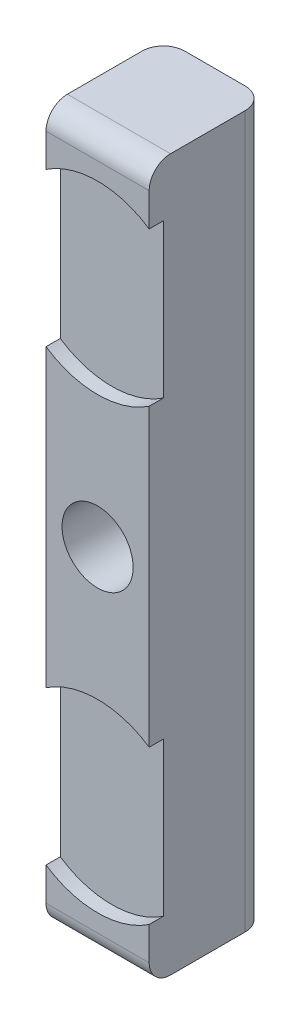
ISO-10303-21;
HEADER;
FILE_DESCRIPTION(('STEP AP214'),'2;1');
FILE_NAME('part.step','',(''),(''),'','','');
FILE_SCHEMA(('AUTOMOTIVE_DESIGN { 1 0 10303 214 1 1 1 1 }'));
ENDSEC;
DATA;
#1=APPLICATION_CONTEXT('core data for automotive mechanical design processes');
#2=APPLICATION_PROTOCOL_DEFINITION('international standard','automotive_design',2000,#1);
#3=PRODUCT_CONTEXT('',#1,'mechanical');
#4=PRODUCT('Part','Part','',(#3));
#5=PRODUCT_RELATED_PRODUCT_CATEGORY('part','',(#4));
#6=PRODUCT_DEFINITION_FORMATION('','',#4);
#7=PRODUCT_DEFINITION_CONTEXT('part definition',#1,'design');
#8=PRODUCT_DEFINITION('design','',#6,#7);
#9=PRODUCT_DEFINITION_SHAPE('','',#8);
#10=(LENGTH_UNIT() NAMED_UNIT(*) SI_UNIT(.MILLI.,.METRE.));
#11=(NAMED_UNIT(*) PLANE_ANGLE_UNIT() SI_UNIT($,.RADIAN.));
#12=(NAMED_UNIT(*) SI_UNIT($,.STERADIAN.) SOLID_ANGLE_UNIT());
#13=UNCERTAINTY_MEASURE_WITH_UNIT(LENGTH_MEASURE(1.E-05),#10,'distance_accuracy_value','');
#14=(GEOMETRIC_REPRESENTATION_CONTEXT(3) GLOBAL_UNCERTAINTY_ASSIGNED_CONTEXT((#13)) GLOBAL_UNIT_ASSIGNED_CONTEXT((#10,
#11,#12)) REPRESENTATION_CONTEXT('',''));
#15=CARTESIAN_POINT('',(0.,0.,0.));
#16=DIRECTION('',(0.,0.,1.));
#17=DIRECTION('',(1.,0.,0.));
#18=AXIS2_PLACEMENT_3D('',#15,#16,#17);
#19=CARTESIAN_POINT('',(7.25,-47.,13.5));
#20=DIRECTION('',(-1.,0.,0.));
#21=DIRECTION('',(0.,0.,1.));
#22=AXIS2_PLACEMENT_3D('',#19,#20,#21);
#23=CYLINDRICAL_SURFACE('',#22,3.);
#24=DIRECTION('',(-1.,0.,0.));
#25=VECTOR('',#24,1.);
#26=CARTESIAN_POINT('',(7.25,-50.,13.5));
#27=LINE('',#26,#25);
#28=CARTESIAN_POINT('',(7.25,-50.,13.5));
#29=VERTEX_POINT('',#28);
#30=CARTESIAN_POINT('',(-7.25,-50.,13.5));
#31=VERTEX_POINT('',#30);
#32=EDGE_CURVE('E240',#29,#31,#27,.T.);
#33=ORIENTED_EDGE('',*,*,#32,.F.);
#34=CARTESIAN_POINT('',(7.25,-47.,13.5));
#35=DIRECTION('',(-1.,0.,0.));
#36=DIRECTION('',(0.,0.,1.));
#37=AXIS2_PLACEMENT_3D('',#34,#35,#36);
#38=CIRCLE('',#37,3.);
#39=CARTESIAN_POINT('',(7.25,-47.,16.5));
#40=VERTEX_POINT('',#39);
#41=EDGE_CURVE('E46',#40,#29,#38,.F.);
#42=ORIENTED_EDGE('',*,*,#41,.F.);
#43=DIRECTION('',(-1.,0.,0.));
#44=VECTOR('',#43,1.);
#45=CARTESIAN_POINT('',(0.,-47.,16.5));
#46=LINE('',#45,#44);
#47=CARTESIAN_POINT('',(-7.25,-47.,16.5));
#48=VERTEX_POINT('',#47);
#49=EDGE_CURVE('E239',#48,#40,#46,.F.);
#50=ORIENTED_EDGE('',*,*,#49,.F.);
#51=CARTESIAN_POINT('',(-7.25,-47.,13.5));
#52=DIRECTION('',(1.,0.,0.));
#53=DIRECTION('',(0.,0.,-1.));
#54=AXIS2_PLACEMENT_3D('',#51,#52,#53);
#55=CIRCLE('',#54,3.);
#56=EDGE_CURVE('E11',#31,#48,#55,.F.);
#57=ORIENTED_EDGE('',*,*,#56,.F.);
#58=EDGE_LOOP('',(#33,#42,#50,#57));
#59=FACE_BOUND('',#58,.T.);
#60=ADVANCED_FACE('F39',(#59),#23,.T.);
#61=CARTESIAN_POINT('',(7.25,47.,13.5));
#62=DIRECTION('',(1.,0.,0.));
#63=DIRECTION('',(0.,0.,-1.));
#64=AXIS2_PLACEMENT_3D('',#61,#62,#63);
#65=CYLINDRICAL_SURFACE('',#64,3.);
#66=DIRECTION('',(1.,0.,0.));
#67=VECTOR('',#66,1.);
#68=CARTESIAN_POINT('',(7.25,50.,13.5));
#69=LINE('',#68,#67);
#70=CARTESIAN_POINT('',(-7.25,50.,13.5));
#71=VERTEX_POINT('',#70);
#72=CARTESIAN_POINT('',(7.25,50.,13.5));
#73=VERTEX_POINT('',#72);
#74=EDGE_CURVE('E227',#71,#73,#69,.T.);
#75=ORIENTED_EDGE('',*,*,#74,.F.);
#76=CARTESIAN_POINT('',(-7.25,47.,13.5));
#77=DIRECTION('',(1.,0.,0.));
#78=DIRECTION('',(0.,0.,-1.));
#79=AXIS2_PLACEMENT_3D('',#76,#77,#78);
#80=CIRCLE('',#79,3.);
#81=CARTESIAN_POINT('',(-7.25,47.,16.5));
#82=VERTEX_POINT('',#81);
#83=EDGE_CURVE('E231',#82,#71,#80,.F.);
#84=ORIENTED_EDGE('',*,*,#83,.F.);
#85=DIRECTION('',(1.,0.,0.));
#86=VECTOR('',#85,1.);
#87=CARTESIAN_POINT('',(0.,47.,16.5));
#88=LINE('',#87,#86);
#89=CARTESIAN_POINT('',(7.25,47.,16.5));
#90=VERTEX_POINT('',#89);
#91=EDGE_CURVE('E229',#90,#82,#88,.F.);
#92=ORIENTED_EDGE('',*,*,#91,.F.);
#93=CARTESIAN_POINT('',(7.25,47.,13.5));
#94=DIRECTION('',(-1.,0.,0.));
#95=DIRECTION('',(0.,0.,1.));
#96=AXIS2_PLACEMENT_3D('',#93,#94,#95);
#97=CIRCLE('',#96,3.);
#98=EDGE_CURVE('E232',#73,#90,#97,.F.);
#99=ORIENTED_EDGE('',*,*,#98,.F.);
#100=EDGE_LOOP('',(#75,#84,#92,#99));
#101=FACE_BOUND('',#100,.T.);
#102=ADVANCED_FACE('F256',(#101),#65,.T.);
#103=CARTESIAN_POINT('',(4.25,0.,3.));
#104=DIRECTION('',(0.,1.,0.));
#105=DIRECTION('',(0.,0.,1.));
#106=AXIS2_PLACEMENT_3D('',#103,#104,#105);
#107=CYLINDRICAL_SURFACE('',#106,3.);
#108=DIRECTION('',(0.,-1.,0.));
#109=VECTOR('',#108,1.);
#110=CARTESIAN_POINT('',(4.25,0.,0.));
#111=LINE('',#110,#109);
#112=CARTESIAN_POINT('',(4.25,50.,0.));
#113=VERTEX_POINT('',#112);
#114=CARTESIAN_POINT('',(4.25,-50.,0.));
#115=VERTEX_POINT('',#114);
#116=EDGE_CURVE('E216',#113,#115,#111,.T.);
#117=ORIENTED_EDGE('',*,*,#116,.F.);
#118=CARTESIAN_POINT('',(4.25,50.,3.));
#119=DIRECTION('',(0.,-1.,0.));
#120=DIRECTION('',(0.,0.,-1.));
#121=AXIS2_PLACEMENT_3D('',#118,#119,#120);
#122=CIRCLE('',#121,3.);
#123=CARTESIAN_POINT('',(7.25,50.,3.));
#124=VERTEX_POINT('',#123);
#125=EDGE_CURVE('E225',#124,#113,#122,.F.);
#126=ORIENTED_EDGE('',*,*,#125,.F.);
#127=DIRECTION('',(0.,-1.,0.));
#128=VECTOR('',#127,1.);
#129=CARTESIAN_POINT('',(7.25,0.,3.));
#130=LINE('',#129,#128);
#131=CARTESIAN_POINT('',(7.25,-50.,3.));
#132=VERTEX_POINT('',#131);
#133=EDGE_CURVE('E217',#132,#124,#130,.F.);
#134=ORIENTED_EDGE('',*,*,#133,.F.);
#135=CARTESIAN_POINT('',(4.25,-50.,3.));
#136=DIRECTION('',(0.,1.,0.));
#137=DIRECTION('',(0.,0.,1.));
#138=AXIS2_PLACEMENT_3D('',#135,#136,#137);
#139=CIRCLE('',#138,3.);
#140=EDGE_CURVE('E222',#115,#132,#139,.F.);
#141=ORIENTED_EDGE('',*,*,#140,.F.);
#142=EDGE_LOOP('',(#117,#126,#134,#141));
#143=FACE_BOUND('',#142,.T.);
#144=ADVANCED_FACE('F249',(#143),#107,.T.);
#145=CARTESIAN_POINT('',(-4.25,-50.,3.));
#146=DIRECTION('',(0.,1.,0.));
#147=DIRECTION('',(0.,0.,1.));
#148=AXIS2_PLACEMENT_3D('',#145,#146,#147);
#149=CYLINDRICAL_SURFACE('',#148,3.);
#150=DIRECTION('',(0.,-1.,0.));
#151=VECTOR('',#150,1.);
#152=CARTESIAN_POINT('',(-7.25,-50.,3.));
#153=LINE('',#152,#151);
#154=CARTESIAN_POINT('',(-7.25,50.,3.));
#155=VERTEX_POINT('',#154);
#156=CARTESIAN_POINT('',(-7.25,-50.,3.));
#157=VERTEX_POINT('',#156);
#158=EDGE_CURVE('E171',#155,#157,#153,.T.);
#159=ORIENTED_EDGE('',*,*,#158,.F.);
#160=CARTESIAN_POINT('',(-4.25,50.,3.));
#161=DIRECTION('',(0.,-1.,0.));
#162=DIRECTION('',(0.,0.,-1.));
#163=AXIS2_PLACEMENT_3D('',#160,#161,#162);
#164=CIRCLE('',#163,3.);
#165=CARTESIAN_POINT('',(-4.25,50.,0.));
#166=VERTEX_POINT('',#165);
#167=EDGE_CURVE('E212',#166,#155,#164,.F.);
#168=ORIENTED_EDGE('',*,*,#167,.F.);
#169=DIRECTION('',(0.,-1.,0.));
#170=VECTOR('',#169,1.);
#171=CARTESIAN_POINT('',(-4.25,-50.,0.));
#172=LINE('',#171,#170);
#173=CARTESIAN_POINT('',(-4.25,-50.,0.));
#174=VERTEX_POINT('',#173);
#175=EDGE_CURVE('E206',#174,#166,#172,.F.);
#176=ORIENTED_EDGE('',*,*,#175,.F.);
#177=CARTESIAN_POINT('',(-4.25,-50.,3.));
#178=DIRECTION('',(0.,1.,0.));
#179=DIRECTION('',(0.,0.,1.));
#180=AXIS2_PLACEMENT_3D('',#177,#178,#179);
#181=CIRCLE('',#180,3.);
#182=EDGE_CURVE('E211',#157,#174,#181,.F.);
#183=ORIENTED_EDGE('',*,*,#182,.F.);
#184=EDGE_LOOP('',(#159,#168,#176,#183));
#185=FACE_BOUND('',#184,.T.);
#186=ADVANCED_FACE('F304',(#185),#149,.T.);
#187=CARTESIAN_POINT('',(0.,0.,16.5));
#188=DIRECTION('',(0.,0.,-1.));
#189=DIRECTION('',(-1.,0.,0.));
#190=AXIS2_PLACEMENT_3D('',#187,#188,#189);
#191=PLANE('',#190);
#192=CARTESIAN_POINT('',(0.,0.,16.5));
#193=DIRECTION('',(0.,0.,1.));
#194=DIRECTION('',(1.,0.,0.));
#195=AXIS2_PLACEMENT_3D('',#192,#193,#194);
#196=CIRCLE('',#195,5.);
#197=CARTESIAN_POINT('',(5.,0.,16.5));
#198=VERTEX_POINT('',#197);
#199=EDGE_CURVE('E300',#198,#198,#196,.T.);
#200=ORIENTED_EDGE('',*,*,#199,.F.);
#201=EDGE_LOOP('',(#200));
#202=FACE_BOUND('',#201,.T.);
#203=DIRECTION('',(0.,1.,0.));
#204=VECTOR('',#203,1.);
#205=CARTESIAN_POINT('',(7.25,-50.,16.5));
#206=LINE('',#205,#204);
#207=CARTESIAN_POINT('',(7.25,-20.7593790725464,16.5));
#208=VERTEX_POINT('',#207);
#209=CARTESIAN_POINT('',(7.25,20.7593790725464,16.5));
#210=VERTEX_POINT('',#209);
#211=EDGE_CURVE('E166',#208,#210,#206,.T.);
#212=ORIENTED_EDGE('',*,*,#211,.T.);
#213=CARTESIAN_POINT('',(0.,31.55,16.5));
#214=DIRECTION('',(0.,0.,-1.));
#215=DIRECTION('',(1.,0.,0.));
#216=AXIS2_PLACEMENT_3D('',#213,#214,#215);
#217=CIRCLE('',#216,13.);
#218=CARTESIAN_POINT('',(-7.25,20.7593790725464,16.5));
#219=VERTEX_POINT('',#218);
#220=EDGE_CURVE('E146',#210,#219,#217,.T.);
#221=ORIENTED_EDGE('',*,*,#220,.T.);
#222=DIRECTION('',(0.,-1.,0.));
#223=VECTOR('',#222,1.);
#224=CARTESIAN_POINT('',(-7.25,-50.,16.5));
#225=LINE('',#224,#223);
#226=CARTESIAN_POINT('',(-7.25,-20.7593790725464,16.5));
#227=VERTEX_POINT('',#226);
#228=EDGE_CURVE('E349',#219,#227,#225,.T.);
#229=ORIENTED_EDGE('',*,*,#228,.T.);
#230=CARTESIAN_POINT('',(0.,-31.55,16.5));
#231=DIRECTION('',(0.,0.,1.));
#232=DIRECTION('',(1.,0.,0.));
#233=AXIS2_PLACEMENT_3D('',#230,#231,#232);
#234=CIRCLE('',#233,13.);
#235=EDGE_CURVE('E180',#208,#227,#234,.T.);
#236=ORIENTED_EDGE('',*,*,#235,.F.);
#237=EDGE_LOOP('',(#212,#221,#229,#236));
#238=FACE_BOUND('',#237,.T.);
#239=ADVANCED_FACE('F174',(#202,#238),#191,.F.);
#240=CARTESIAN_POINT('',(7.25,42.3406209274536,16.5));
#241=VERTEX_POINT('',#240);
#242=EDGE_CURVE('E177',#241,#90,#206,.T.);
#243=ORIENTED_EDGE('',*,*,#242,.T.);
#244=ORIENTED_EDGE('',*,*,#91,.T.);
#245=CARTESIAN_POINT('',(-7.25,42.3406209274536,16.5));
#246=VERTEX_POINT('',#245);
#247=EDGE_CURVE('E182',#82,#246,#225,.T.);
#248=ORIENTED_EDGE('',*,*,#247,.T.);
#249=EDGE_CURVE('E163',#246,#241,#217,.T.);
#250=ORIENTED_EDGE('',*,*,#249,.T.);
#251=EDGE_LOOP('',(#243,#244,#248,#250));
#252=FACE_BOUND('',#251,.T.);
#253=ADVANCED_FACE('F263',(#252),#191,.F.);
#254=CARTESIAN_POINT('',(-7.25,-50.,16.5));
#255=DIRECTION('',(1.,0.,0.));
#256=DIRECTION('',(0.,0.,-1.));
#257=AXIS2_PLACEMENT_3D('',#254,#255,#256);
#258=PLANE('',#257);
#259=DIRECTION('',(0.,0.,-1.));
#260=VECTOR('',#259,1.);
#261=CARTESIAN_POINT('',(-7.25,-50.,16.5));
#262=LINE('',#261,#260);
#263=EDGE_CURVE('E200',#31,#157,#262,.T.);
#264=ORIENTED_EDGE('',*,*,#263,.F.);
#265=ORIENTED_EDGE('',*,*,#56,.T.);
#266=CARTESIAN_POINT('',(-7.25,-42.3406209274536,16.5));
#267=VERTEX_POINT('',#266);
#268=EDGE_CURVE('E195',#267,#48,#225,.T.);
#269=ORIENTED_EDGE('',*,*,#268,.F.);
#270=DIRECTION('',(0.,0.,1.));
#271=VECTOR('',#270,1.);
#272=CARTESIAN_POINT('',(-7.25,-42.3406209274536,14.5));
#273=LINE('',#272,#271);
#274=CARTESIAN_POINT('',(-7.25,-42.3406209274536,14.5));
#275=VERTEX_POINT('',#274);
#276=EDGE_CURVE('E287',#267,#275,#273,.F.);
#277=ORIENTED_EDGE('',*,*,#276,.T.);
#278=DIRECTION('',(0.,-1.,0.));
#279=VECTOR('',#278,1.);
#280=CARTESIAN_POINT('',(-7.25,-50.,14.5));
#281=LINE('',#280,#279);
#282=CARTESIAN_POINT('',(-7.25,-20.7593790725464,14.5));
#283=VERTEX_POINT('',#282);
#284=EDGE_CURVE('E294',#283,#275,#281,.T.);
#285=ORIENTED_EDGE('',*,*,#284,.F.);
#286=DIRECTION('',(0.,0.,1.));
#287=VECTOR('',#286,1.);
#288=CARTESIAN_POINT('',(-7.25,-20.7593790725464,14.5));
#289=LINE('',#288,#287);
#290=EDGE_CURVE('E292',#283,#227,#289,.T.);
#291=ORIENTED_EDGE('',*,*,#290,.T.);
#292=ORIENTED_EDGE('',*,*,#228,.F.);
#293=DIRECTION('',(0.,0.,1.));
#294=VECTOR('',#293,1.);
#295=CARTESIAN_POINT('',(-7.25,20.7593790725464,14.5));
#296=LINE('',#295,#294);
#297=CARTESIAN_POINT('',(-7.25,20.7593790725464,14.5));
#298=VERTEX_POINT('',#297);
#299=EDGE_CURVE('E156',#298,#219,#296,.T.);
#300=ORIENTED_EDGE('',*,*,#299,.F.);
#301=DIRECTION('',(0.,-1.,0.));
#302=VECTOR('',#301,1.);
#303=CARTESIAN_POINT('',(-7.25,-50.,14.5));
#304=LINE('',#303,#302);
#305=CARTESIAN_POINT('',(-7.25,42.3406209274536,14.5));
#306=VERTEX_POINT('',#305);
#307=EDGE_CURVE('E273',#306,#298,#304,.T.);
#308=ORIENTED_EDGE('',*,*,#307,.F.);
#309=DIRECTION('',(0.,0.,1.));
#310=VECTOR('',#309,1.);
#311=CARTESIAN_POINT('',(-7.25,42.3406209274536,14.5));
#312=LINE('',#311,#310);
#313=EDGE_CURVE('E269',#246,#306,#312,.F.);
#314=ORIENTED_EDGE('',*,*,#313,.F.);
#315=ORIENTED_EDGE('',*,*,#247,.F.);
#316=ORIENTED_EDGE('',*,*,#83,.T.);
#317=DIRECTION('',(0.,0.,-1.));
#318=VECTOR('',#317,1.);
#319=CARTESIAN_POINT('',(-7.25,50.,16.5));
#320=LINE('',#319,#318);
#321=EDGE_CURVE('E197',#71,#155,#320,.T.);
#322=ORIENTED_EDGE('',*,*,#321,.T.);
#323=ORIENTED_EDGE('',*,*,#158,.T.);
#324=EDGE_LOOP('',(#264,#265,#269,#277,#285,#291,#292,#300,#308,#314,#315,#316,#322,#323));
#325=FACE_BOUND('',#324,.T.);
#326=ADVANCED_FACE('F312',(#325),#258,.F.);
#327=CARTESIAN_POINT('',(7.25,-50.,16.5));
#328=DIRECTION('',(-1.,0.,0.));
#329=DIRECTION('',(0.,0.,1.));
#330=AXIS2_PLACEMENT_3D('',#327,#328,#329);
#331=PLANE('',#330);
#332=CARTESIAN_POINT('',(7.25,-42.3406209274536,16.5));
#333=VERTEX_POINT('',#332);
#334=EDGE_CURVE('E178',#40,#333,#206,.T.);
#335=ORIENTED_EDGE('',*,*,#334,.F.);
#336=ORIENTED_EDGE('',*,*,#41,.T.);
#337=DIRECTION('',(0.,0.,-1.));
#338=VECTOR('',#337,1.);
#339=CARTESIAN_POINT('',(7.25,-50.,16.5));
#340=LINE('',#339,#338);
#341=EDGE_CURVE('E193',#29,#132,#340,.T.);
#342=ORIENTED_EDGE('',*,*,#341,.T.);
#343=ORIENTED_EDGE('',*,*,#133,.T.);
#344=DIRECTION('',(0.,0.,-1.));
#345=VECTOR('',#344,1.);
#346=CARTESIAN_POINT('',(7.25,50.,16.5));
#347=LINE('',#346,#345);
#348=EDGE_CURVE('E181',#73,#124,#347,.T.);
#349=ORIENTED_EDGE('',*,*,#348,.F.);
#350=ORIENTED_EDGE('',*,*,#98,.T.);
#351=ORIENTED_EDGE('',*,*,#242,.F.);
#352=DIRECTION('',(0.,0.,1.));
#353=VECTOR('',#352,1.);
#354=CARTESIAN_POINT('',(7.25,42.3406209274536,14.5));
#355=LINE('',#354,#353);
#356=CARTESIAN_POINT('',(7.25,42.3406209274536,14.5));
#357=VERTEX_POINT('',#356);
#358=EDGE_CURVE('E175',#357,#241,#355,.T.);
#359=ORIENTED_EDGE('',*,*,#358,.F.);
#360=DIRECTION('',(0.,1.,0.));
#361=VECTOR('',#360,1.);
#362=CARTESIAN_POINT('',(7.25,-50.,14.5));
#363=LINE('',#362,#361);
#364=CARTESIAN_POINT('',(7.25,20.7593790725464,14.5));
#365=VERTEX_POINT('',#364);
#366=EDGE_CURVE('E167',#365,#357,#363,.T.);
#367=ORIENTED_EDGE('',*,*,#366,.F.);
#368=DIRECTION('',(0.,0.,1.));
#369=VECTOR('',#368,1.);
#370=CARTESIAN_POINT('',(7.25,20.7593790725464,14.5));
#371=LINE('',#370,#369);
#372=EDGE_CURVE('E153',#210,#365,#371,.F.);
#373=ORIENTED_EDGE('',*,*,#372,.F.);
#374=ORIENTED_EDGE('',*,*,#211,.F.);
#375=DIRECTION('',(0.,0.,1.));
#376=VECTOR('',#375,1.);
#377=CARTESIAN_POINT('',(7.25,-20.7593790725464,14.5));
#378=LINE('',#377,#376);
#379=CARTESIAN_POINT('',(7.25,-20.7593790725464,14.5));
#380=VERTEX_POINT('',#379);
#381=EDGE_CURVE('E283',#208,#380,#378,.F.);
#382=ORIENTED_EDGE('',*,*,#381,.T.);
#383=DIRECTION('',(0.,1.,0.));
#384=VECTOR('',#383,1.);
#385=CARTESIAN_POINT('',(7.25,-50.,14.5));
#386=LINE('',#385,#384);
#387=CARTESIAN_POINT('',(7.25,-42.3406209274536,14.5));
#388=VERTEX_POINT('',#387);
#389=EDGE_CURVE('E205',#388,#380,#386,.T.);
#390=ORIENTED_EDGE('',*,*,#389,.F.);
#391=DIRECTION('',(0.,0.,1.));
#392=VECTOR('',#391,1.);
#393=CARTESIAN_POINT('',(7.25,-42.3406209274536,14.5));
#394=LINE('',#393,#392);
#395=EDGE_CURVE('E290',#388,#333,#394,.T.);
#396=ORIENTED_EDGE('',*,*,#395,.T.);
#397=EDGE_LOOP('',(#335,#336,#342,#343,#349,#350,#351,#359,#367,#373,#374,#382,#390,#396));
#398=FACE_BOUND('',#397,.T.);
#399=ADVANCED_FACE('F168',(#398),#331,.F.);
#400=ORIENTED_EDGE('',*,*,#268,.T.);
#401=ORIENTED_EDGE('',*,*,#49,.T.);
#402=ORIENTED_EDGE('',*,*,#334,.T.);
#403=EDGE_CURVE('E201',#267,#333,#234,.T.);
#404=ORIENTED_EDGE('',*,*,#403,.F.);
#405=EDGE_LOOP('',(#400,#401,#402,#404));
#406=FACE_BOUND('',#405,.T.);
#407=ADVANCED_FACE('F310',(#406),#191,.F.);
#408=CARTESIAN_POINT('',(7.25,50.,16.5));
#409=DIRECTION('',(0.,-1.,0.));
#410=DIRECTION('',(0.,0.,-1.));
#411=AXIS2_PLACEMENT_3D('',#408,#409,#410);
#412=PLANE('',#411);
#413=ORIENTED_EDGE('',*,*,#321,.F.);
#414=ORIENTED_EDGE('',*,*,#74,.T.);
#415=ORIENTED_EDGE('',*,*,#348,.T.);
#416=ORIENTED_EDGE('',*,*,#125,.T.);
#417=DIRECTION('',(-1.,0.,0.));
#418=VECTOR('',#417,1.);
#419=CARTESIAN_POINT('',(7.25,50.,0.));
#420=LINE('',#419,#418);
#421=EDGE_CURVE('E190',#113,#166,#420,.T.);
#422=ORIENTED_EDGE('',*,*,#421,.T.);
#423=ORIENTED_EDGE('',*,*,#167,.T.);
#424=EDGE_LOOP('',(#413,#414,#415,#416,#422,#423));
#425=FACE_BOUND('',#424,.T.);
#426=ADVANCED_FACE('F257',(#425),#412,.F.);
#427=CARTESIAN_POINT('',(7.25,-50.,16.5));
#428=DIRECTION('',(0.,1.,0.));
#429=DIRECTION('',(0.,0.,1.));
#430=AXIS2_PLACEMENT_3D('',#427,#428,#429);
#431=PLANE('',#430);
#432=ORIENTED_EDGE('',*,*,#341,.F.);
#433=ORIENTED_EDGE('',*,*,#32,.T.);
#434=ORIENTED_EDGE('',*,*,#263,.T.);
#435=ORIENTED_EDGE('',*,*,#182,.T.);
#436=DIRECTION('',(1.,0.,0.));
#437=VECTOR('',#436,1.);
#438=CARTESIAN_POINT('',(7.25,-50.,0.));
#439=LINE('',#438,#437);
#440=EDGE_CURVE('E186',#174,#115,#439,.T.);
#441=ORIENTED_EDGE('',*,*,#440,.T.);
#442=ORIENTED_EDGE('',*,*,#140,.T.);
#443=EDGE_LOOP('',(#432,#433,#434,#435,#441,#442));
#444=FACE_BOUND('',#443,.T.);
#445=ADVANCED_FACE('F242',(#444),#431,.F.);
#446=CARTESIAN_POINT('',(0.,0.,0.));
#447=DIRECTION('',(0.,0.,-1.));
#448=DIRECTION('',(-1.,0.,0.));
#449=AXIS2_PLACEMENT_3D('',#446,#447,#448);
#450=PLANE('',#449);
#451=ORIENTED_EDGE('',*,*,#421,.F.);
#452=ORIENTED_EDGE('',*,*,#116,.T.);
#453=ORIENTED_EDGE('',*,*,#440,.F.);
#454=ORIENTED_EDGE('',*,*,#175,.T.);
#455=EDGE_LOOP('',(#451,#452,#453,#454));
#456=FACE_BOUND('',#455,.T.);
#457=ADVANCED_FACE('F340',(#456),#450,.T.);
#458=CARTESIAN_POINT('',(0.,0.,3.5));
#459=DIRECTION('',(0.,0.,1.));
#460=DIRECTION('',(1.,0.,0.));
#461=AXIS2_PLACEMENT_3D('',#458,#459,#460);
#462=CYLINDRICAL_SURFACE('',#461,5.);
#463=CARTESIAN_POINT('',(0.,0.,3.5));
#464=DIRECTION('',(0.,0.,1.));
#465=DIRECTION('',(1.,0.,0.));
#466=AXIS2_PLACEMENT_3D('',#463,#464,#465);
#467=CIRCLE('',#466,5.);
#468=CARTESIAN_POINT('',(5.,0.,3.5));
#469=VERTEX_POINT('',#468);
#470=EDGE_CURVE('E188',#469,#469,#467,.T.);
#471=CARTESIAN_POINT('',(5.,0.,3.5));
#472=CARTESIAN_POINT('',(5.,0.,3.63541666666667));
#473=CARTESIAN_POINT('',(5.,0.,3.77083333333333));
#474=CARTESIAN_POINT('',(5.,0.,4.04166666666667));
#475=CARTESIAN_POINT('',(5.,0.,4.17708333333333));
#476=CARTESIAN_POINT('',(5.,0.,4.44791666666667));
#477=CARTESIAN_POINT('',(5.,0.,4.58333333333333));
#478=CARTESIAN_POINT('',(5.,0.,4.85416666666667));
#479=CARTESIAN_POINT('',(5.,0.,4.98958333333333));
#480=CARTESIAN_POINT('',(5.,0.,5.26041666666667));
#481=CARTESIAN_POINT('',(5.,0.,5.39583333333333));
#482=CARTESIAN_POINT('',(5.,0.,5.66666666666667));
#483=CARTESIAN_POINT('',(5.,0.,5.80208333333333));
#484=CARTESIAN_POINT('',(5.,0.,6.07291666666667));
#485=CARTESIAN_POINT('',(5.,0.,6.20833333333333));
#486=CARTESIAN_POINT('',(5.,0.,6.47916666666667));
#487=CARTESIAN_POINT('',(5.,0.,6.61458333333333));
#488=CARTESIAN_POINT('',(5.,0.,6.88541666666667));
#489=CARTESIAN_POINT('',(5.,0.,7.02083333333333));
#490=CARTESIAN_POINT('',(5.,0.,7.29166666666667));
#491=CARTESIAN_POINT('',(5.,0.,7.42708333333333));
#492=CARTESIAN_POINT('',(5.,0.,7.69791666666667));
#493=CARTESIAN_POINT('',(5.,0.,7.83333333333333));
#494=CARTESIAN_POINT('',(5.,0.,8.10416666666667));
#495=CARTESIAN_POINT('',(5.,0.,8.23958333333333));
#496=CARTESIAN_POINT('',(5.,0.,8.51041666666667));
#497=CARTESIAN_POINT('',(5.,0.,8.64583333333333));
#498=CARTESIAN_POINT('',(5.,0.,8.91666666666667));
#499=CARTESIAN_POINT('',(5.,0.,9.05208333333333));
#500=CARTESIAN_POINT('',(5.,0.,9.32291666666666));
#501=CARTESIAN_POINT('',(5.,0.,9.45833333333333));
#502=CARTESIAN_POINT('',(5.,0.,9.72916666666667));
#503=CARTESIAN_POINT('',(5.,0.,9.86458333333333));
#504=CARTESIAN_POINT('',(5.,0.,10.1354166666667));
#505=CARTESIAN_POINT('',(5.,0.,10.2708333333333));
#506=CARTESIAN_POINT('',(5.,0.,10.5416666666667));
#507=CARTESIAN_POINT('',(5.,0.,10.6770833333333));
#508=CARTESIAN_POINT('',(5.,0.,10.9479166666667));
#509=CARTESIAN_POINT('',(5.,0.,11.0833333333333));
#510=CARTESIAN_POINT('',(5.,0.,11.3541666666667));
#511=CARTESIAN_POINT('',(5.,0.,11.4895833333333));
#512=CARTESIAN_POINT('',(5.,0.,11.7604166666667));
#513=CARTESIAN_POINT('',(5.,0.,11.8958333333333));
#514=CARTESIAN_POINT('',(5.,0.,12.1666666666667));
#515=CARTESIAN_POINT('',(5.,0.,12.3020833333333));
#516=CARTESIAN_POINT('',(5.,0.,12.5729166666667));
#517=CARTESIAN_POINT('',(5.,0.,12.7083333333333));
#518=CARTESIAN_POINT('',(5.,0.,12.9791666666667));
#519=CARTESIAN_POINT('',(5.,0.,13.1145833333333));
#520=CARTESIAN_POINT('',(5.,0.,13.3854166666667));
#521=CARTESIAN_POINT('',(5.,0.,13.5208333333333));
#522=CARTESIAN_POINT('',(5.,0.,13.7916666666667));
#523=CARTESIAN_POINT('',(5.,0.,13.9270833333333));
#524=CARTESIAN_POINT('',(5.,0.,14.1979166666667));
#525=CARTESIAN_POINT('',(5.,0.,14.3333333333333));
#526=CARTESIAN_POINT('',(5.,0.,14.6041666666667));
#527=CARTESIAN_POINT('',(5.,0.,14.7395833333333));
#528=CARTESIAN_POINT('',(5.,0.,15.0104166666667));
#529=CARTESIAN_POINT('',(5.,0.,15.1458333333333));
#530=CARTESIAN_POINT('',(5.,0.,15.4166666666667));
#531=CARTESIAN_POINT('',(5.,0.,15.5520833333333));
#532=CARTESIAN_POINT('',(5.,0.,15.8229166666667));
#533=CARTESIAN_POINT('',(5.,0.,15.9583333333333));
#534=CARTESIAN_POINT('',(5.,0.,16.2291666666667));
#535=CARTESIAN_POINT('',(5.,0.,16.3645833333333));
#536=CARTESIAN_POINT('',(5.,0.,16.5));
#537=B_SPLINE_CURVE_WITH_KNOTS('',3,(#471,#472,#473,#474,#475,#476,#477,#478,#479,#480,#481,
#482,#483,#484,#485,#486,#487,#488,#489,#490,#491,#492,#493,#494,#495,#496,#497,#498,#499,#500,
#501,#502,#503,#504,#505,#506,#507,#508,#509,#510,#511,#512,#513,#514,#515,#516,#517,#518,#519,
#520,#521,#522,#523,#524,#525,#526,#527,#528,#529,#530,#531,#532,#533,#534,#535,#536),
.UNSPECIFIED.,.F.,.F.,(4,2,2,2,2,2,2,2,2,2,2,2,2,2,2,2,2,2,2,2,2,2,2,2,2,2,2,2,2,2,2,2,4),(0.,
0.40625,0.8125,1.21875,1.625,2.03125,2.4375,2.84375,3.25,3.65625,4.0625,4.46875,4.875,5.28125,
5.6875,6.09375,6.5,6.90625,7.3125,7.71875,8.125,8.53125,8.9375,9.34375,9.75,10.15625,10.5625,
10.96875,11.375,11.78125,12.1875,12.59375,13.),.UNSPECIFIED.);
#538=EDGE_CURVE('BSEAM305',#469,#198,#537,.T.);
#539=ORIENTED_EDGE('',*,*,#470,.F.);
#540=ORIENTED_EDGE('',*,*,#199,.T.);
#541=ORIENTED_EDGE('',*,*,#538,.T.);
#542=ORIENTED_EDGE('',*,*,#538,.F.);
#543=EDGE_LOOP('',(#539,#541,#540,#542));
#544=FACE_BOUND('',#543,.T.);
#545=ADVANCED_FACE('F305',(#544),#462,.F.);
#546=CARTESIAN_POINT('',(0.,0.,3.5));
#547=DIRECTION('',(0.,0.,1.));
#548=DIRECTION('',(1.,0.,0.));
#549=AXIS2_PLACEMENT_3D('',#546,#547,#548);
#550=PLANE('',#549);
#551=ORIENTED_EDGE('',*,*,#470,.T.);
#552=EDGE_LOOP('',(#551));
#553=FACE_BOUND('',#552,.T.);
#554=ADVANCED_FACE('F345',(#553),#550,.T.);
#555=CARTESIAN_POINT('',(0.,-31.55,14.5));
#556=DIRECTION('',(0.,0.,1.));
#557=DIRECTION('',(1.,0.,0.));
#558=AXIS2_PLACEMENT_3D('',#555,#556,#557);
#559=PLANE('',#558);
#560=ORIENTED_EDGE('',*,*,#284,.T.);
#561=CARTESIAN_POINT('',(0.,-31.55,14.5));
#562=DIRECTION('',(0.,0.,1.));
#563=DIRECTION('',(1.,0.,0.));
#564=AXIS2_PLACEMENT_3D('',#561,#562,#563);
#565=CIRCLE('',#564,13.);
#566=EDGE_CURVE('E282',#275,#388,#565,.T.);
#567=ORIENTED_EDGE('',*,*,#566,.T.);
#568=ORIENTED_EDGE('',*,*,#389,.T.);
#569=EDGE_CURVE('E278',#380,#283,#565,.T.);
#570=ORIENTED_EDGE('',*,*,#569,.T.);
#571=EDGE_LOOP('',(#560,#567,#568,#570));
#572=FACE_BOUND('',#571,.T.);
#573=ADVANCED_FACE('F363',(#572),#559,.T.);
#574=CARTESIAN_POINT('',(0.,-31.55,14.5));
#575=DIRECTION('',(0.,0.,1.));
#576=DIRECTION('',(1.,0.,0.));
#577=AXIS2_PLACEMENT_3D('',#574,#575,#576);
#578=CYLINDRICAL_SURFACE('',#577,13.);
#579=ORIENTED_EDGE('',*,*,#569,.F.);
#580=ORIENTED_EDGE('',*,*,#381,.F.);
#581=ORIENTED_EDGE('',*,*,#235,.T.);
#582=ORIENTED_EDGE('',*,*,#290,.F.);
#583=EDGE_LOOP('',(#579,#580,#581,#582));
#584=FACE_BOUND('',#583,.T.);
#585=ADVANCED_FACE('F364',(#584),#578,.F.);
#586=ORIENTED_EDGE('',*,*,#403,.T.);
#587=ORIENTED_EDGE('',*,*,#395,.F.);
#588=ORIENTED_EDGE('',*,*,#566,.F.);
#589=ORIENTED_EDGE('',*,*,#276,.F.);
#590=EDGE_LOOP('',(#586,#587,#588,#589));
#591=FACE_BOUND('',#590,.T.);
#592=ADVANCED_FACE('F357',(#591),#578,.F.);
#593=CARTESIAN_POINT('',(0.,31.55,14.5));
#594=DIRECTION('',(0.,0.,1.));
#595=DIRECTION('',(1.,0.,0.));
#596=AXIS2_PLACEMENT_3D('',#593,#594,#595);
#597=CYLINDRICAL_SURFACE('',#596,13.);
#598=ORIENTED_EDGE('',*,*,#313,.T.);
#599=CARTESIAN_POINT('',(0.,31.55,14.5));
#600=DIRECTION('',(0.,0.,-1.));
#601=DIRECTION('',(1.,0.,0.));
#602=AXIS2_PLACEMENT_3D('',#599,#600,#601);
#603=CIRCLE('',#602,13.);
#604=EDGE_CURVE('E159',#306,#357,#603,.T.);
#605=ORIENTED_EDGE('',*,*,#604,.T.);
#606=ORIENTED_EDGE('',*,*,#358,.T.);
#607=ORIENTED_EDGE('',*,*,#249,.F.);
#608=EDGE_LOOP('',(#598,#605,#606,#607));
#609=FACE_BOUND('',#608,.T.);
#610=ADVANCED_FACE('F270',(#609),#597,.F.);
#611=ORIENTED_EDGE('',*,*,#299,.T.);
#612=ORIENTED_EDGE('',*,*,#220,.F.);
#613=ORIENTED_EDGE('',*,*,#372,.T.);
#614=EDGE_CURVE('E271',#365,#298,#603,.T.);
#615=ORIENTED_EDGE('',*,*,#614,.T.);
#616=EDGE_LOOP('',(#611,#612,#613,#615));
#617=FACE_BOUND('',#616,.T.);
#618=ADVANCED_FACE('F151',(#617),#597,.F.);
#619=CARTESIAN_POINT('',(0.,31.55,14.5));
#620=DIRECTION('',(0.,0.,1.));
#621=DIRECTION('',(1.,0.,0.));
#622=AXIS2_PLACEMENT_3D('',#619,#620,#621);
#623=PLANE('',#622);
#624=ORIENTED_EDGE('',*,*,#307,.T.);
#625=ORIENTED_EDGE('',*,*,#614,.F.);
#626=ORIENTED_EDGE('',*,*,#366,.T.);
#627=ORIENTED_EDGE('',*,*,#604,.F.);
#628=EDGE_LOOP('',(#624,#625,#626,#627));
#629=FACE_BOUND('',#628,.T.);
#630=ADVANCED_FACE('F362',(#629),#623,.T.);
#631=CLOSED_SHELL('',(#60,#102,#144,#186,#239,#253,#326,#399,#407,#426,#445,#457,#545,#554,#573,
#585,#592,#610,#618,#630));
#632=MANIFOLD_SOLID_BREP('B2',#631);
#633=ADVANCED_BREP_SHAPE_REPRESENTATION('',(#18,#632),#14);
#634=SHAPE_DEFINITION_REPRESENTATION(#9,#633);
ENDSEC;
END-ISO-10303-21;
